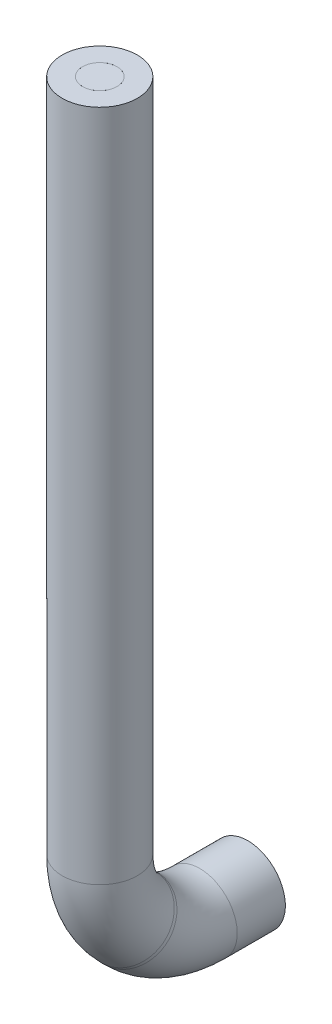
ISO-10303-21;
HEADER;
FILE_DESCRIPTION(('STEP AP214'),'2;1');
FILE_NAME('part.step','',(''),(''),'','','');
FILE_SCHEMA(('AUTOMOTIVE_DESIGN { 1 0 10303 214 1 1 1 1 }'));
ENDSEC;
DATA;
#1=APPLICATION_CONTEXT('core data for automotive mechanical design processes');
#2=APPLICATION_PROTOCOL_DEFINITION('international standard','automotive_design',2000,#1);
#3=PRODUCT_CONTEXT('',#1,'mechanical');
#4=PRODUCT('Part','Part','',(#3));
#5=PRODUCT_RELATED_PRODUCT_CATEGORY('part','',(#4));
#6=PRODUCT_DEFINITION_FORMATION('','',#4);
#7=PRODUCT_DEFINITION_CONTEXT('part definition',#1,'design');
#8=PRODUCT_DEFINITION('design','',#6,#7);
#9=PRODUCT_DEFINITION_SHAPE('','',#8);
#10=(LENGTH_UNIT() NAMED_UNIT(*) SI_UNIT(.MILLI.,.METRE.));
#11=(NAMED_UNIT(*) PLANE_ANGLE_UNIT() SI_UNIT($,.RADIAN.));
#12=(NAMED_UNIT(*) SI_UNIT($,.STERADIAN.) SOLID_ANGLE_UNIT());
#13=UNCERTAINTY_MEASURE_WITH_UNIT(LENGTH_MEASURE(1.E-05),#10,'distance_accuracy_value','');
#14=(GEOMETRIC_REPRESENTATION_CONTEXT(3) GLOBAL_UNCERTAINTY_ASSIGNED_CONTEXT((#13)) GLOBAL_UNIT_ASSIGNED_CONTEXT((#10,
#11,#12)) REPRESENTATION_CONTEXT('',''));
#15=CARTESIAN_POINT('',(0.,0.,0.));
#16=DIRECTION('',(0.,0.,1.));
#17=DIRECTION('',(1.,0.,0.));
#18=AXIS2_PLACEMENT_3D('',#15,#16,#17);
#19=CARTESIAN_POINT('',(0.,17.49999984,0.));
#20=DIRECTION('',(0.,-1.,0.));
#21=DIRECTION('',(0.,0.,-1.));
#22=AXIS2_PLACEMENT_3D('',#19,#20,#21);
#23=CYLINDRICAL_SURFACE('',#22,0.85);
#24=CARTESIAN_POINT('',(0.,2.26126984,0.));
#25=DIRECTION('',(0.,-1.,0.));
#26=DIRECTION('',(-1.,0.,0.));
#27=AXIS2_PLACEMENT_3D('',#24,#25,#26);
#28=CIRCLE('',#27,0.85);
#29=CARTESIAN_POINT('',(0.,2.26126984,0.849999999999996));
#30=VERTEX_POINT('',#29);
#31=EDGE_CURVE('E67',#30,#30,#28,.T.);
#32=ORIENTED_EDGE('',*,*,#31,.F.);
#33=EDGE_LOOP('',(#32));
#34=FACE_BOUND('',#33,.T.);
#35=CARTESIAN_POINT('',(0.,17.49999984,0.));
#36=DIRECTION('',(0.,-1.,0.));
#37=DIRECTION('',(-1.,0.,0.));
#38=AXIS2_PLACEMENT_3D('',#35,#36,#37);
#39=CIRCLE('',#38,0.85);
#40=CARTESIAN_POINT('',(-0.85,17.49999984,0.));
#41=VERTEX_POINT('',#40);
#42=EDGE_CURVE('E64',#41,#41,#39,.T.);
#43=ORIENTED_EDGE('',*,*,#42,.T.);
#44=EDGE_LOOP('',(#43));
#45=FACE_BOUND('',#44,.T.);
#46=ADVANCED_FACE('F43',(#34,#45),#23,.T.);
#47=CARTESIAN_POINT('',(0.,2.26126984,-2.2));
#48=DIRECTION('',(1.,0.,0.));
#49=DIRECTION('',(0.,0.,-1.));
#50=AXIS2_PLACEMENT_3D('',#47,#48,#49);
#51=TOROIDAL_SURFACE('',#50,2.2,0.85);
#52=CARTESIAN_POINT('',(0.,0.705634921389592,-0.644365081389606));
#53=DIRECTION('',(0.,-0.707106781186543,-0.707106781186552));
#54=DIRECTION('',(-1.,0.,0.));
#55=AXIS2_PLACEMENT_3D('',#52,#53,#54);
#56=CIRCLE('',#55,0.85);
#57=CARTESIAN_POINT('',(0.,0.104594157381024,-0.0433243173810446));
#58=VERTEX_POINT('',#57);
#59=EDGE_CURVE('E70',#58,#58,#56,.T.);
#60=CARTESIAN_POINT('',(0.,2.26126984,-2.2));
#61=DIRECTION('',(1.,0.,0.));
#62=DIRECTION('',(0.,0.,-1.));
#63=AXIS2_PLACEMENT_3D('',#60,#61,#62);
#64=CIRCLE('',#63,3.05);
#65=EDGE_CURVE('',#30,#58,#64,.T.);
#66=ORIENTED_EDGE('',*,*,#31,.T.);
#67=ORIENTED_EDGE('',*,*,#59,.F.);
#68=ORIENTED_EDGE('',*,*,#65,.T.);
#69=ORIENTED_EDGE('',*,*,#65,.F.);
#70=EDGE_LOOP('',(#66,#68,#67,#69));
#71=FACE_BOUND('',#70,.T.);
#72=ADVANCED_FACE('F89',(#71),#51,.T.);
#73=CARTESIAN_POINT('',(0.,0.705634921389593,-0.644365081389607));
#74=DIRECTION('',(0.,-0.70710678118655,-0.707106781186545));
#75=DIRECTION('',(0.,0.707106781186545,-0.70710678118655));
#76=AXIS2_PLACEMENT_3D('',#73,#74,#75);
#77=CYLINDRICAL_SURFACE('',#76,0.85);
#78=CARTESIAN_POINT('',(0.,0.644365081389588,-0.705634921389611));
#79=DIRECTION('',(0.,-0.707106781186549,-0.707106781186546));
#80=DIRECTION('',(-1.,0.,0.));
#81=AXIS2_PLACEMENT_3D('',#78,#79,#80);
#82=CIRCLE('',#81,0.85);
#83=CARTESIAN_POINT('',(0.,0.0433243173810194,-0.104594157381049));
#84=VERTEX_POINT('',#83);
#85=EDGE_CURVE('E72',#84,#84,#82,.T.);
#86=ORIENTED_EDGE('',*,*,#85,.F.);
#87=EDGE_LOOP('',(#86));
#88=FACE_BOUND('',#87,.T.);
#89=ORIENTED_EDGE('',*,*,#59,.T.);
#90=EDGE_LOOP('',(#89));
#91=FACE_BOUND('',#90,.T.);
#92=ADVANCED_FACE('F82',(#88,#91),#77,.T.);
#93=CARTESIAN_POINT('',(0.,2.2,-2.26126984000001));
#94=DIRECTION('',(1.,0.,0.));
#95=DIRECTION('',(0.,0.,-1.));
#96=AXIS2_PLACEMENT_3D('',#93,#94,#95);
#97=TOROIDAL_SURFACE('',#96,2.2,0.85);
#98=CARTESIAN_POINT('',(0.,0.,-2.26126984000001));
#99=DIRECTION('',(0.,0.,-1.));
#100=DIRECTION('',(-1.,0.,0.));
#101=AXIS2_PLACEMENT_3D('',#98,#99,#100);
#102=CIRCLE('',#101,0.85);
#103=CARTESIAN_POINT('',(0.,-0.849999999999998,-2.26126984000001));
#104=VERTEX_POINT('',#103);
#105=EDGE_CURVE('E47',#104,#104,#102,.T.);
#106=CARTESIAN_POINT('',(0.,2.2,-2.26126984000001));
#107=DIRECTION('',(1.,0.,0.));
#108=DIRECTION('',(0.,0.,-1.));
#109=AXIS2_PLACEMENT_3D('',#106,#107,#108);
#110=CIRCLE('',#109,3.05);
#111=EDGE_CURVE('',#84,#104,#110,.T.);
#112=ORIENTED_EDGE('',*,*,#85,.T.);
#113=ORIENTED_EDGE('',*,*,#105,.F.);
#114=ORIENTED_EDGE('',*,*,#111,.T.);
#115=ORIENTED_EDGE('',*,*,#111,.F.);
#116=EDGE_LOOP('',(#112,#114,#113,#115));
#117=FACE_BOUND('',#116,.T.);
#118=ADVANCED_FACE('F80',(#117),#97,.T.);
#119=CARTESIAN_POINT('',(0.,0.,-2.26126984000001));
#120=DIRECTION('',(0.,0.,-1.));
#121=DIRECTION('',(0.,1.,0.));
#122=AXIS2_PLACEMENT_3D('',#119,#120,#121);
#123=CYLINDRICAL_SURFACE('',#122,0.85);
#124=CARTESIAN_POINT('',(0.,0.,-3.35));
#125=DIRECTION('',(0.,0.,-1.));
#126=DIRECTION('',(-1.,0.,0.));
#127=AXIS2_PLACEMENT_3D('',#124,#125,#126);
#128=CIRCLE('',#127,0.85);
#129=CARTESIAN_POINT('',(-0.85,0.,-3.35));
#130=VERTEX_POINT('',#129);
#131=EDGE_CURVE('E60',#130,#130,#128,.T.);
#132=ORIENTED_EDGE('',*,*,#131,.F.);
#133=EDGE_LOOP('',(#132));
#134=FACE_BOUND('',#133,.T.);
#135=ORIENTED_EDGE('',*,*,#105,.T.);
#136=EDGE_LOOP('',(#135));
#137=FACE_BOUND('',#136,.T.);
#138=ADVANCED_FACE('F45',(#134,#137),#123,.T.);
#139=CARTESIAN_POINT('',(0.,17.49999984,0.));
#140=DIRECTION('',(0.,-1.,0.));
#141=DIRECTION('',(-1.,0.,0.));
#142=AXIS2_PLACEMENT_3D('',#139,#140,#141);
#143=PLANE('',#142);
#144=CARTESIAN_POINT('',(0.,17.49999984,0.));
#145=DIRECTION('',(0.,-1.,0.));
#146=DIRECTION('',(-1.,0.,0.));
#147=AXIS2_PLACEMENT_3D('',#144,#145,#146);
#148=CIRCLE('',#147,0.39);
#149=CARTESIAN_POINT('',(-0.39,17.49999984,0.));
#150=VERTEX_POINT('',#149);
#151=EDGE_CURVE('E63',#150,#150,#148,.F.);
#152=ORIENTED_EDGE('',*,*,#151,.F.);
#153=EDGE_LOOP('',(#152));
#154=FACE_BOUND('',#153,.T.);
#155=ORIENTED_EDGE('',*,*,#42,.F.);
#156=EDGE_LOOP('',(#155));
#157=FACE_BOUND('',#156,.T.);
#158=ADVANCED_FACE('F87',(#154,#157),#143,.F.);
#159=CARTESIAN_POINT('',(0.,0.,-3.35));
#160=DIRECTION('',(0.,0.,-1.));
#161=DIRECTION('',(-1.,0.,0.));
#162=AXIS2_PLACEMENT_3D('',#159,#160,#161);
#163=PLANE('',#162);
#164=CARTESIAN_POINT('',(0.,0.,-3.35));
#165=DIRECTION('',(0.,0.,-1.));
#166=DIRECTION('',(-1.,0.,0.));
#167=AXIS2_PLACEMENT_3D('',#164,#165,#166);
#168=CIRCLE('',#167,0.39);
#169=CARTESIAN_POINT('',(-0.39,0.,-3.35));
#170=VERTEX_POINT('',#169);
#171=EDGE_CURVE('E11',#170,#170,#168,.F.);
#172=ORIENTED_EDGE('',*,*,#171,.T.);
#173=EDGE_LOOP('',(#172));
#174=FACE_BOUND('',#173,.T.);
#175=ORIENTED_EDGE('',*,*,#131,.T.);
#176=EDGE_LOOP('',(#175));
#177=FACE_BOUND('',#176,.T.);
#178=ADVANCED_FACE('F106',(#174,#177),#163,.T.);
#179=CARTESIAN_POINT('',(0.,17.49999984,0.));
#180=DIRECTION('',(0.,-1.,0.));
#181=DIRECTION('',(0.,0.,-1.));
#182=AXIS2_PLACEMENT_3D('',#179,#180,#181);
#183=CYLINDRICAL_SURFACE('',#182,0.39);
#184=CARTESIAN_POINT('',(0.,2.26126984,0.));
#185=DIRECTION('',(0.,-1.,0.));
#186=DIRECTION('',(-1.,0.,0.));
#187=AXIS2_PLACEMENT_3D('',#184,#185,#186);
#188=CIRCLE('',#187,0.39);
#189=CARTESIAN_POINT('',(0.,2.26126984,0.389999999999996));
#190=VERTEX_POINT('',#189);
#191=EDGE_CURVE('E202',#190,#190,#188,.F.);
#192=ORIENTED_EDGE('',*,*,#191,.F.);
#193=EDGE_LOOP('',(#192));
#194=FACE_BOUND('',#193,.T.);
#195=ORIENTED_EDGE('',*,*,#151,.T.);
#196=EDGE_LOOP('',(#195));
#197=FACE_BOUND('',#196,.T.);
#198=ADVANCED_FACE('F109',(#194,#197),#183,.F.);
#199=CARTESIAN_POINT('',(0.,2.26126984,-2.2));
#200=DIRECTION('',(1.,0.,0.));
#201=DIRECTION('',(0.,0.,-1.));
#202=AXIS2_PLACEMENT_3D('',#199,#200,#201);
#203=TOROIDAL_SURFACE('',#202,2.2,0.39);
#204=CARTESIAN_POINT('',(0.,0.705634921389592,-0.644365081389606));
#205=DIRECTION('',(0.,-0.707106781186543,-0.707106781186552));
#206=DIRECTION('',(-1.,0.,0.));
#207=AXIS2_PLACEMENT_3D('',#204,#205,#206);
#208=CIRCLE('',#207,0.39);
#209=CARTESIAN_POINT('',(0.,0.429863276726838,-0.368593436726855));
#210=VERTEX_POINT('',#209);
#211=EDGE_CURVE('E201',#210,#210,#208,.F.);
#212=CARTESIAN_POINT('',(0.,2.26126984,-2.2));
#213=DIRECTION('',(1.,0.,0.));
#214=DIRECTION('',(0.,0.,-1.));
#215=AXIS2_PLACEMENT_3D('',#212,#213,#214);
#216=CIRCLE('',#215,2.59);
#217=EDGE_CURVE('',#190,#210,#216,.T.);
#218=ORIENTED_EDGE('',*,*,#191,.T.);
#219=ORIENTED_EDGE('',*,*,#211,.F.);
#220=ORIENTED_EDGE('',*,*,#217,.T.);
#221=ORIENTED_EDGE('',*,*,#217,.F.);
#222=EDGE_LOOP('',(#218,#220,#219,#221));
#223=FACE_BOUND('',#222,.T.);
#224=ADVANCED_FACE('F164',(#223),#203,.F.);
#225=CARTESIAN_POINT('',(0.,0.705634921389593,-0.644365081389607));
#226=DIRECTION('',(0.,-0.70710678118655,-0.707106781186545));
#227=DIRECTION('',(0.,0.707106781186545,-0.70710678118655));
#228=AXIS2_PLACEMENT_3D('',#225,#226,#227);
#229=CYLINDRICAL_SURFACE('',#228,0.39);
#230=CARTESIAN_POINT('',(0.,0.644365081389588,-0.705634921389611));
#231=DIRECTION('',(0.,-0.707106781186549,-0.707106781186546));
#232=DIRECTION('',(-1.,0.,0.));
#233=AXIS2_PLACEMENT_3D('',#230,#231,#232);
#234=CIRCLE('',#233,0.39);
#235=CARTESIAN_POINT('',(0.,0.368593436726833,-0.429863276726859));
#236=VERTEX_POINT('',#235);
#237=EDGE_CURVE('E56',#236,#236,#234,.F.);
#238=ORIENTED_EDGE('',*,*,#237,.F.);
#239=EDGE_LOOP('',(#238));
#240=FACE_BOUND('',#239,.T.);
#241=ORIENTED_EDGE('',*,*,#211,.T.);
#242=EDGE_LOOP('',(#241));
#243=FACE_BOUND('',#242,.T.);
#244=ADVANCED_FACE('F100',(#240,#243),#229,.F.);
#245=CARTESIAN_POINT('',(0.,2.2,-2.26126984000001));
#246=DIRECTION('',(1.,0.,0.));
#247=DIRECTION('',(0.,0.,-1.));
#248=AXIS2_PLACEMENT_3D('',#245,#246,#247);
#249=TOROIDAL_SURFACE('',#248,2.2,0.39);
#250=CARTESIAN_POINT('',(0.,0.,-2.26126984000001));
#251=DIRECTION('',(0.,0.,-1.));
#252=DIRECTION('',(-1.,0.,0.));
#253=AXIS2_PLACEMENT_3D('',#250,#251,#252);
#254=CIRCLE('',#253,0.39);
#255=CARTESIAN_POINT('',(0.,-0.389999999999998,-2.26126984000001));
#256=VERTEX_POINT('',#255);
#257=EDGE_CURVE('E51',#256,#256,#254,.F.);
#258=CARTESIAN_POINT('',(0.,2.2,-2.26126984000001));
#259=DIRECTION('',(1.,0.,0.));
#260=DIRECTION('',(0.,0.,-1.));
#261=AXIS2_PLACEMENT_3D('',#258,#259,#260);
#262=CIRCLE('',#261,2.59);
#263=EDGE_CURVE('',#236,#256,#262,.T.);
#264=ORIENTED_EDGE('',*,*,#237,.T.);
#265=ORIENTED_EDGE('',*,*,#257,.F.);
#266=ORIENTED_EDGE('',*,*,#263,.T.);
#267=ORIENTED_EDGE('',*,*,#263,.F.);
#268=EDGE_LOOP('',(#264,#266,#265,#267));
#269=FACE_BOUND('',#268,.T.);
#270=ADVANCED_FACE('F94',(#269),#249,.F.);
#271=CARTESIAN_POINT('',(0.,0.,-2.26126984000001));
#272=DIRECTION('',(0.,0.,-1.));
#273=DIRECTION('',(0.,1.,0.));
#274=AXIS2_PLACEMENT_3D('',#271,#272,#273);
#275=CYLINDRICAL_SURFACE('',#274,0.39);
#276=ORIENTED_EDGE('',*,*,#171,.F.);
#277=EDGE_LOOP('',(#276));
#278=FACE_BOUND('',#277,.T.);
#279=ORIENTED_EDGE('',*,*,#257,.T.);
#280=EDGE_LOOP('',(#279));
#281=FACE_BOUND('',#280,.T.);
#282=ADVANCED_FACE('F92',(#278,#281),#275,.F.);
#283=CLOSED_SHELL('',(#46,#72,#92,#118,#138,#158,#178,#198,#224,#244,#270,#282));
#284=MANIFOLD_SOLID_BREP('B2',#283);
#285=CARTESIAN_POINT('',(0.,17.49999984,0.));
#286=DIRECTION('',(0.,1.,0.));
#287=DIRECTION('',(1.,0.,0.));
#288=AXIS2_PLACEMENT_3D('',#285,#286,#287);
#289=PLANE('',#288);
#290=CARTESIAN_POINT('',(0.,17.49999984,0.));
#291=DIRECTION('',(0.,1.,0.));
#292=DIRECTION('',(1.,0.,0.));
#293=AXIS2_PLACEMENT_3D('',#290,#291,#292);
#294=CIRCLE('',#293,0.39);
#295=CARTESIAN_POINT('',(0.39,17.49999984,0.));
#296=VERTEX_POINT('',#295);
#297=EDGE_CURVE('E247',#296,#296,#294,.T.);
#298=ORIENTED_EDGE('',*,*,#297,.T.);
#299=EDGE_LOOP('',(#298));
#300=FACE_BOUND('',#299,.T.);
#301=ADVANCED_FACE('F225',(#300),#289,.T.);
#302=CARTESIAN_POINT('',(0.,0.,-3.35));
#303=DIRECTION('',(0.,0.,1.));
#304=DIRECTION('',(1.,0.,0.));
#305=AXIS2_PLACEMENT_3D('',#302,#303,#304);
#306=PLANE('',#305);
#307=CARTESIAN_POINT('',(0.,0.,-3.35));
#308=DIRECTION('',(0.,0.,1.));
#309=DIRECTION('',(1.,0.,0.));
#310=AXIS2_PLACEMENT_3D('',#307,#308,#309);
#311=CIRCLE('',#310,0.39);
#312=CARTESIAN_POINT('',(0.39,0.,-3.35));
#313=VERTEX_POINT('',#312);
#314=EDGE_CURVE('E42',#313,#313,#311,.T.);
#315=ORIENTED_EDGE('',*,*,#314,.F.);
#316=EDGE_LOOP('',(#315));
#317=FACE_BOUND('',#316,.T.);
#318=ADVANCED_FACE('F255',(#317),#306,.F.);
#319=CARTESIAN_POINT('',(0.,17.49999984,0.));
#320=DIRECTION('',(0.,-1.,0.));
#321=DIRECTION('',(0.,0.,-1.));
#322=AXIS2_PLACEMENT_3D('',#319,#320,#321);
#323=CYLINDRICAL_SURFACE('',#322,0.39);
#324=CARTESIAN_POINT('',(0.,2.26126984,0.));
#325=DIRECTION('',(0.,1.,0.));
#326=DIRECTION('',(1.,0.,0.));
#327=AXIS2_PLACEMENT_3D('',#324,#325,#326);
#328=CIRCLE('',#327,0.39);
#329=CARTESIAN_POINT('',(0.,2.26126984,0.389999999999996));
#330=VERTEX_POINT('',#329);
#331=EDGE_CURVE('E244',#330,#330,#328,.T.);
#332=ORIENTED_EDGE('',*,*,#331,.T.);
#333=EDGE_LOOP('',(#332));
#334=FACE_BOUND('',#333,.T.);
#335=ORIENTED_EDGE('',*,*,#297,.F.);
#336=EDGE_LOOP('',(#335));
#337=FACE_BOUND('',#336,.T.);
#338=ADVANCED_FACE('F252',(#334,#337),#323,.T.);
#339=CARTESIAN_POINT('',(0.,2.26126984,-2.2));
#340=DIRECTION('',(1.,0.,0.));
#341=DIRECTION('',(0.,0.,-1.));
#342=AXIS2_PLACEMENT_3D('',#339,#340,#341);
#343=TOROIDAL_SURFACE('',#342,2.2,0.39);
#344=CARTESIAN_POINT('',(0.,0.705634921389592,-0.644365081389606));
#345=DIRECTION('',(0.,0.707106781186543,0.707106781186552));
#346=DIRECTION('',(1.,0.,0.));
#347=AXIS2_PLACEMENT_3D('',#344,#345,#346);
#348=CIRCLE('',#347,0.39);
#349=CARTESIAN_POINT('',(0.,0.429863276726838,-0.368593436726855));
#350=VERTEX_POINT('',#349);
#351=EDGE_CURVE('E239',#350,#350,#348,.T.);
#352=CARTESIAN_POINT('',(0.,2.26126984,-2.2));
#353=DIRECTION('',(1.,0.,0.));
#354=DIRECTION('',(0.,0.,-1.));
#355=AXIS2_PLACEMENT_3D('',#352,#353,#354);
#356=CIRCLE('',#355,2.59);
#357=EDGE_CURVE('',#330,#350,#356,.T.);
#358=ORIENTED_EDGE('',*,*,#331,.F.);
#359=ORIENTED_EDGE('',*,*,#351,.T.);
#360=ORIENTED_EDGE('',*,*,#357,.T.);
#361=ORIENTED_EDGE('',*,*,#357,.F.);
#362=EDGE_LOOP('',(#358,#360,#359,#361));
#363=FACE_BOUND('',#362,.T.);
#364=ADVANCED_FACE('F254',(#363),#343,.T.);
#365=CARTESIAN_POINT('',(0.,0.705634921389593,-0.644365081389607));
#366=DIRECTION('',(0.,-0.70710678118655,-0.707106781186545));
#367=DIRECTION('',(0.,0.707106781186545,-0.70710678118655));
#368=AXIS2_PLACEMENT_3D('',#365,#366,#367);
#369=CYLINDRICAL_SURFACE('',#368,0.39);
#370=CARTESIAN_POINT('',(0.,0.644365081389588,-0.705634921389611));
#371=DIRECTION('',(0.,0.707106781186549,0.707106781186546));
#372=DIRECTION('',(1.,0.,0.));
#373=AXIS2_PLACEMENT_3D('',#370,#371,#372);
#374=CIRCLE('',#373,0.39);
#375=CARTESIAN_POINT('',(0.,0.368593436726833,-0.429863276726859));
#376=VERTEX_POINT('',#375);
#377=EDGE_CURVE('E235',#376,#376,#374,.T.);
#378=ORIENTED_EDGE('',*,*,#377,.T.);
#379=EDGE_LOOP('',(#378));
#380=FACE_BOUND('',#379,.T.);
#381=ORIENTED_EDGE('',*,*,#351,.F.);
#382=EDGE_LOOP('',(#381));
#383=FACE_BOUND('',#382,.T.);
#384=ADVANCED_FACE('F262',(#380,#383),#369,.T.);
#385=CARTESIAN_POINT('',(0.,2.2,-2.26126984000001));
#386=DIRECTION('',(1.,0.,0.));
#387=DIRECTION('',(0.,0.,-1.));
#388=AXIS2_PLACEMENT_3D('',#385,#386,#387);
#389=TOROIDAL_SURFACE('',#388,2.2,0.39);
#390=CARTESIAN_POINT('',(0.,0.,-2.26126984000001));
#391=DIRECTION('',(0.,0.,1.));
#392=DIRECTION('',(1.,0.,0.));
#393=AXIS2_PLACEMENT_3D('',#390,#391,#392);
#394=CIRCLE('',#393,0.39);
#395=CARTESIAN_POINT('',(0.,-0.389999999999998,-2.26126984000001));
#396=VERTEX_POINT('',#395);
#397=EDGE_CURVE('E231',#396,#396,#394,.T.);
#398=CARTESIAN_POINT('',(0.,2.2,-2.26126984000001));
#399=DIRECTION('',(1.,0.,0.));
#400=DIRECTION('',(0.,0.,-1.));
#401=AXIS2_PLACEMENT_3D('',#398,#399,#400);
#402=CIRCLE('',#401,2.59);
#403=EDGE_CURVE('',#376,#396,#402,.T.);
#404=ORIENTED_EDGE('',*,*,#377,.F.);
#405=ORIENTED_EDGE('',*,*,#397,.T.);
#406=ORIENTED_EDGE('',*,*,#403,.T.);
#407=ORIENTED_EDGE('',*,*,#403,.F.);
#408=EDGE_LOOP('',(#404,#406,#405,#407));
#409=FACE_BOUND('',#408,.T.);
#410=ADVANCED_FACE('F268',(#409),#389,.T.);
#411=CARTESIAN_POINT('',(0.,0.,-2.26126984000001));
#412=DIRECTION('',(0.,0.,-1.));
#413=DIRECTION('',(0.,1.,0.));
#414=AXIS2_PLACEMENT_3D('',#411,#412,#413);
#415=CYLINDRICAL_SURFACE('',#414,0.39);
#416=ORIENTED_EDGE('',*,*,#314,.T.);
#417=EDGE_LOOP('',(#416));
#418=FACE_BOUND('',#417,.T.);
#419=ORIENTED_EDGE('',*,*,#397,.F.);
#420=EDGE_LOOP('',(#419));
#421=FACE_BOUND('',#420,.T.);
#422=ADVANCED_FACE('F266',(#418,#421),#415,.T.);
#423=CLOSED_SHELL('',(#301,#318,#338,#364,#384,#410,#422));
#424=MANIFOLD_SOLID_BREP('B6',#423);
#425=ADVANCED_BREP_SHAPE_REPRESENTATION('',(#18,#284,#424),#14);
#426=SHAPE_DEFINITION_REPRESENTATION(#9,#425);
ENDSEC;
END-ISO-10303-21;
